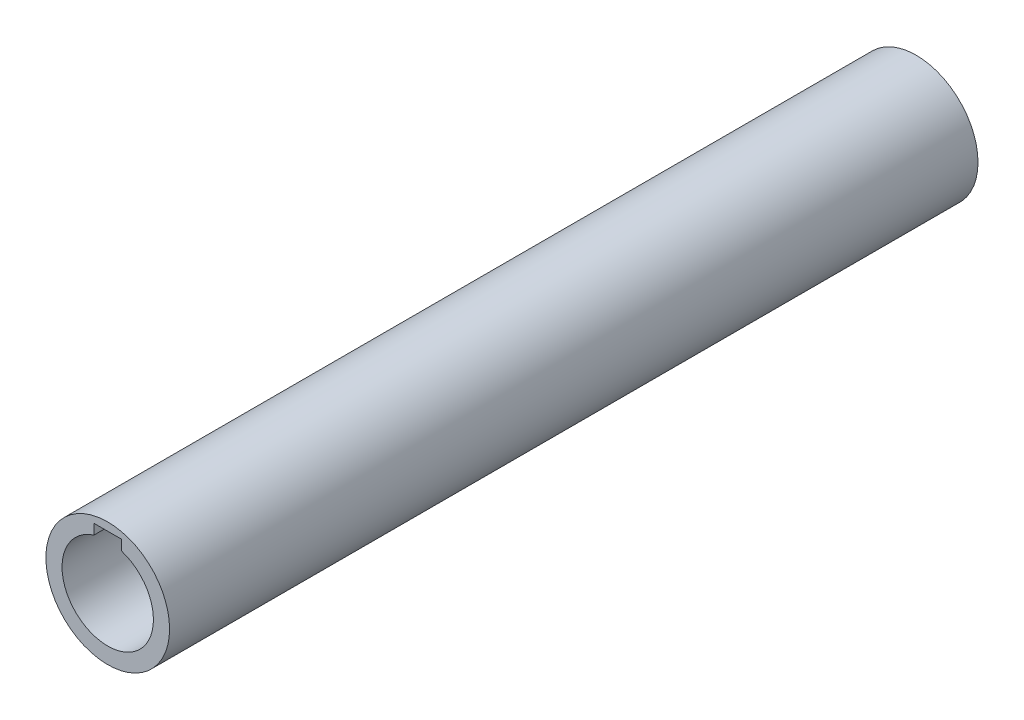
ISO-10303-21;
HEADER;
FILE_DESCRIPTION(('STEP AP214'),'2;1');
FILE_NAME('part.step','',(''),(''),'','','');
FILE_SCHEMA(('AUTOMOTIVE_DESIGN { 1 0 10303 214 1 1 1 1 }'));
ENDSEC;
DATA;
#1=APPLICATION_CONTEXT('core data for automotive mechanical design processes');
#2=APPLICATION_PROTOCOL_DEFINITION('international standard','automotive_design',2000,#1);
#3=PRODUCT_CONTEXT('',#1,'mechanical');
#4=PRODUCT('Part','Part','',(#3));
#5=PRODUCT_RELATED_PRODUCT_CATEGORY('part','',(#4));
#6=PRODUCT_DEFINITION_FORMATION('','',#4);
#7=PRODUCT_DEFINITION_CONTEXT('part definition',#1,'design');
#8=PRODUCT_DEFINITION('design','',#6,#7);
#9=PRODUCT_DEFINITION_SHAPE('','',#8);
#10=(LENGTH_UNIT() NAMED_UNIT(*) SI_UNIT(.MILLI.,.METRE.));
#11=(NAMED_UNIT(*) PLANE_ANGLE_UNIT() SI_UNIT($,.RADIAN.));
#12=(NAMED_UNIT(*) SI_UNIT($,.STERADIAN.) SOLID_ANGLE_UNIT());
#13=UNCERTAINTY_MEASURE_WITH_UNIT(LENGTH_MEASURE(1.E-05),#10,'distance_accuracy_value','');
#14=(GEOMETRIC_REPRESENTATION_CONTEXT(3) GLOBAL_UNCERTAINTY_ASSIGNED_CONTEXT((#13)) GLOBAL_UNIT_ASSIGNED_CONTEXT((#10,
#11,#12)) REPRESENTATION_CONTEXT('',''));
#15=CARTESIAN_POINT('',(0.,0.,0.));
#16=DIRECTION('',(0.,0.,1.));
#17=DIRECTION('',(1.,0.,0.));
#18=AXIS2_PLACEMENT_3D('',#15,#16,#17);
#19=CARTESIAN_POINT('',(0.,0.,-250.));
#20=DIRECTION('',(0.,0.,-1.));
#21=DIRECTION('',(1.,0.,0.));
#22=AXIS2_PLACEMENT_3D('',#19,#20,#21);
#23=PLANE('',#22);
#24=CARTESIAN_POINT('',(0.,0.,-250.));
#25=DIRECTION('',(0.,0.,1.));
#26=DIRECTION('',(1.,0.,0.));
#27=AXIS2_PLACEMENT_3D('',#24,#25,#26);
#28=CIRCLE('',#27,38.25);
#29=CARTESIAN_POINT('',(38.25,0.,-250.));
#30=VERTEX_POINT('',#29);
#31=EDGE_CURVE('E134',#30,#30,#28,.T.);
#32=ORIENTED_EDGE('',*,*,#31,.F.);
#33=EDGE_LOOP('',(#32));
#34=FACE_BOUND('',#33,.T.);
#35=DIRECTION('',(0.,-1.,0.));
#36=VECTOR('',#35,1.);
#37=CARTESIAN_POINT('',(-8.5,26.9409075570961,-250.));
#38=LINE('',#37,#36);
#39=CARTESIAN_POINT('',(-8.5,33.25,-250.));
#40=VERTEX_POINT('',#39);
#41=CARTESIAN_POINT('',(-8.5,26.9409075570961,-250.));
#42=VERTEX_POINT('',#41);
#43=EDGE_CURVE('E128',#40,#42,#38,.T.);
#44=ORIENTED_EDGE('',*,*,#43,.T.);
#45=CARTESIAN_POINT('',(0.,0.,-250.));
#46=DIRECTION('',(0.,0.,1.));
#47=DIRECTION('',(1.,0.,0.));
#48=AXIS2_PLACEMENT_3D('',#45,#46,#47);
#49=CIRCLE('',#48,28.25);
#50=CARTESIAN_POINT('',(8.5,26.9409075570961,-250.));
#51=VERTEX_POINT('',#50);
#52=EDGE_CURVE('E49',#42,#51,#49,.T.);
#53=ORIENTED_EDGE('',*,*,#52,.T.);
#54=DIRECTION('',(0.,1.,0.));
#55=VECTOR('',#54,1.);
#56=CARTESIAN_POINT('',(8.5,26.9409075570961,-250.));
#57=LINE('',#56,#55);
#58=CARTESIAN_POINT('',(8.5,33.25,-250.));
#59=VERTEX_POINT('',#58);
#60=EDGE_CURVE('E119',#51,#59,#57,.T.);
#61=ORIENTED_EDGE('',*,*,#60,.T.);
#62=DIRECTION('',(-1.,0.,0.));
#63=VECTOR('',#62,1.);
#64=CARTESIAN_POINT('',(8.5,33.25,-250.));
#65=LINE('',#64,#63);
#66=EDGE_CURVE('E122',#59,#40,#65,.T.);
#67=ORIENTED_EDGE('',*,*,#66,.T.);
#68=EDGE_LOOP('',(#44,#53,#61,#67));
#69=FACE_BOUND('',#68,.T.);
#70=ADVANCED_FACE('F34',(#34,#69),#23,.T.);
#71=CARTESIAN_POINT('',(0.,0.,250.));
#72=DIRECTION('',(0.,0.,-1.));
#73=DIRECTION('',(-1.,0.,0.));
#74=AXIS2_PLACEMENT_3D('',#71,#72,#73);
#75=CYLINDRICAL_SURFACE('',#74,38.25);
#76=CARTESIAN_POINT('',(0.,0.,250.));
#77=DIRECTION('',(0.,0.,1.));
#78=DIRECTION('',(1.,0.,0.));
#79=AXIS2_PLACEMENT_3D('',#76,#77,#78);
#80=CIRCLE('',#79,38.25);
#81=CARTESIAN_POINT('',(38.25,0.,250.));
#82=VERTEX_POINT('',#81);
#83=EDGE_CURVE('E11',#82,#82,#80,.T.);
#84=ORIENTED_EDGE('',*,*,#83,.F.);
#85=EDGE_LOOP('',(#84));
#86=FACE_BOUND('',#85,.T.);
#87=ORIENTED_EDGE('',*,*,#31,.T.);
#88=EDGE_LOOP('',(#87));
#89=FACE_BOUND('',#88,.T.);
#90=ADVANCED_FACE('F36',(#86,#89),#75,.T.);
#91=CARTESIAN_POINT('',(0.,0.,250.));
#92=DIRECTION('',(0.,0.,1.));
#93=DIRECTION('',(1.,0.,0.));
#94=AXIS2_PLACEMENT_3D('',#91,#92,#93);
#95=PLANE('',#94);
#96=CARTESIAN_POINT('',(0.,0.,250.));
#97=DIRECTION('',(0.,0.,1.));
#98=DIRECTION('',(1.,0.,0.));
#99=AXIS2_PLACEMENT_3D('',#96,#97,#98);
#100=CIRCLE('',#99,28.25);
#101=CARTESIAN_POINT('',(-8.5,26.9409075570961,250.));
#102=VERTEX_POINT('',#101);
#103=CARTESIAN_POINT('',(8.5,26.9409075570961,250.));
#104=VERTEX_POINT('',#103);
#105=EDGE_CURVE('E57',#102,#104,#100,.T.);
#106=ORIENTED_EDGE('',*,*,#105,.F.);
#107=DIRECTION('',(0.,-1.,0.));
#108=VECTOR('',#107,1.);
#109=CARTESIAN_POINT('',(-8.5,26.9409075570961,250.));
#110=LINE('',#109,#108);
#111=CARTESIAN_POINT('',(-8.5,33.25,250.));
#112=VERTEX_POINT('',#111);
#113=EDGE_CURVE('E144',#112,#102,#110,.T.);
#114=ORIENTED_EDGE('',*,*,#113,.F.);
#115=DIRECTION('',(-1.,0.,0.));
#116=VECTOR('',#115,1.);
#117=CARTESIAN_POINT('',(8.5,33.25,250.));
#118=LINE('',#117,#116);
#119=CARTESIAN_POINT('',(8.5,33.25,250.));
#120=VERTEX_POINT('',#119);
#121=EDGE_CURVE('E158',#120,#112,#118,.T.);
#122=ORIENTED_EDGE('',*,*,#121,.F.);
#123=DIRECTION('',(0.,1.,0.));
#124=VECTOR('',#123,1.);
#125=CARTESIAN_POINT('',(8.5,26.9409075570961,250.));
#126=LINE('',#125,#124);
#127=EDGE_CURVE('E155',#104,#120,#126,.T.);
#128=ORIENTED_EDGE('',*,*,#127,.F.);
#129=EDGE_LOOP('',(#106,#114,#122,#128));
#130=FACE_BOUND('',#129,.T.);
#131=ORIENTED_EDGE('',*,*,#83,.T.);
#132=EDGE_LOOP('',(#131));
#133=FACE_BOUND('',#132,.T.);
#134=ADVANCED_FACE('F174',(#130,#133),#95,.T.);
#135=CARTESIAN_POINT('',(0.,0.,200.));
#136=DIRECTION('',(0.,0.,1.));
#137=DIRECTION('',(1.,0.,0.));
#138=AXIS2_PLACEMENT_3D('',#135,#136,#137);
#139=CYLINDRICAL_SURFACE('',#138,28.25);
#140=ORIENTED_EDGE('',*,*,#105,.T.);
#141=DIRECTION('',(0.,0.,1.));
#142=VECTOR('',#141,1.);
#143=CARTESIAN_POINT('',(8.5,26.9409075570961,200.));
#144=LINE('',#143,#142);
#145=CARTESIAN_POINT('',(8.5,26.9409075570961,200.));
#146=VERTEX_POINT('',#145);
#147=EDGE_CURVE('E153',#146,#104,#144,.T.);
#148=ORIENTED_EDGE('',*,*,#147,.F.);
#149=CARTESIAN_POINT('',(0.,0.,200.));
#150=DIRECTION('',(0.,0.,1.));
#151=DIRECTION('',(1.,0.,0.));
#152=AXIS2_PLACEMENT_3D('',#149,#150,#151);
#153=CIRCLE('',#152,28.25);
#154=CARTESIAN_POINT('',(-8.5,26.9409075570961,200.));
#155=VERTEX_POINT('',#154);
#156=EDGE_CURVE('E140',#155,#146,#153,.T.);
#157=ORIENTED_EDGE('',*,*,#156,.F.);
#158=DIRECTION('',(0.,0.,1.));
#159=VECTOR('',#158,1.);
#160=CARTESIAN_POINT('',(-8.5,26.9409075570961,200.));
#161=LINE('',#160,#159);
#162=EDGE_CURVE('E42',#155,#102,#161,.T.);
#163=ORIENTED_EDGE('',*,*,#162,.T.);
#164=EDGE_LOOP('',(#140,#148,#157,#163));
#165=FACE_BOUND('',#164,.T.);
#166=ADVANCED_FACE('F183',(#165),#139,.F.);
#167=CARTESIAN_POINT('',(-8.5,26.9409075570961,200.));
#168=DIRECTION('',(-1.,0.,0.));
#169=DIRECTION('',(0.,-1.,0.));
#170=AXIS2_PLACEMENT_3D('',#167,#168,#169);
#171=PLANE('',#170);
#172=ORIENTED_EDGE('',*,*,#113,.T.);
#173=ORIENTED_EDGE('',*,*,#162,.F.);
#174=DIRECTION('',(0.,-1.,0.));
#175=VECTOR('',#174,1.);
#176=CARTESIAN_POINT('',(-8.5,26.9409075570961,200.));
#177=LINE('',#176,#175);
#178=CARTESIAN_POINT('',(-8.5,33.25,200.));
#179=VERTEX_POINT('',#178);
#180=EDGE_CURVE('E150',#179,#155,#177,.T.);
#181=ORIENTED_EDGE('',*,*,#180,.F.);
#182=DIRECTION('',(0.,0.,1.));
#183=VECTOR('',#182,1.);
#184=CARTESIAN_POINT('',(-8.5,33.25,200.));
#185=LINE('',#184,#183);
#186=EDGE_CURVE('E164',#179,#112,#185,.T.);
#187=ORIENTED_EDGE('',*,*,#186,.T.);
#188=EDGE_LOOP('',(#172,#173,#181,#187));
#189=FACE_BOUND('',#188,.T.);
#190=ADVANCED_FACE('F185',(#189),#171,.F.);
#191=CARTESIAN_POINT('',(8.5,33.25,200.));
#192=DIRECTION('',(0.,1.,0.));
#193=DIRECTION('',(0.,0.,1.));
#194=AXIS2_PLACEMENT_3D('',#191,#192,#193);
#195=PLANE('',#194);
#196=ORIENTED_EDGE('',*,*,#121,.T.);
#197=ORIENTED_EDGE('',*,*,#186,.F.);
#198=DIRECTION('',(-1.,0.,0.));
#199=VECTOR('',#198,1.);
#200=CARTESIAN_POINT('',(8.5,33.25,200.));
#201=LINE('',#200,#199);
#202=CARTESIAN_POINT('',(8.5,33.25,200.));
#203=VERTEX_POINT('',#202);
#204=EDGE_CURVE('E147',#203,#179,#201,.T.);
#205=ORIENTED_EDGE('',*,*,#204,.F.);
#206=DIRECTION('',(0.,0.,1.));
#207=VECTOR('',#206,1.);
#208=CARTESIAN_POINT('',(8.5,33.25,200.));
#209=LINE('',#208,#207);
#210=EDGE_CURVE('E166',#203,#120,#209,.T.);
#211=ORIENTED_EDGE('',*,*,#210,.T.);
#212=EDGE_LOOP('',(#196,#197,#205,#211));
#213=FACE_BOUND('',#212,.T.);
#214=ADVANCED_FACE('F178',(#213),#195,.F.);
#215=CARTESIAN_POINT('',(8.5,26.9409075570961,200.));
#216=DIRECTION('',(1.,0.,0.));
#217=DIRECTION('',(0.,1.,0.));
#218=AXIS2_PLACEMENT_3D('',#215,#216,#217);
#219=PLANE('',#218);
#220=ORIENTED_EDGE('',*,*,#127,.T.);
#221=ORIENTED_EDGE('',*,*,#210,.F.);
#222=DIRECTION('',(0.,1.,0.));
#223=VECTOR('',#222,1.);
#224=CARTESIAN_POINT('',(8.5,26.9409075570961,200.));
#225=LINE('',#224,#223);
#226=EDGE_CURVE('E143',#146,#203,#225,.T.);
#227=ORIENTED_EDGE('',*,*,#226,.F.);
#228=ORIENTED_EDGE('',*,*,#147,.T.);
#229=EDGE_LOOP('',(#220,#221,#227,#228));
#230=FACE_BOUND('',#229,.T.);
#231=ADVANCED_FACE('F170',(#230),#219,.F.);
#232=CARTESIAN_POINT('',(0.,0.,200.));
#233=DIRECTION('',(0.,0.,1.));
#234=DIRECTION('',(1.,0.,0.));
#235=AXIS2_PLACEMENT_3D('',#232,#233,#234);
#236=PLANE('',#235);
#237=ORIENTED_EDGE('',*,*,#156,.T.);
#238=ORIENTED_EDGE('',*,*,#226,.T.);
#239=ORIENTED_EDGE('',*,*,#204,.T.);
#240=ORIENTED_EDGE('',*,*,#180,.T.);
#241=EDGE_LOOP('',(#237,#238,#239,#240));
#242=FACE_BOUND('',#241,.T.);
#243=ADVANCED_FACE('F182',(#242),#236,.T.);
#244=CARTESIAN_POINT('',(0.,0.,-200.));
#245=DIRECTION('',(0.,0.,-1.));
#246=DIRECTION('',(-1.,0.,0.));
#247=AXIS2_PLACEMENT_3D('',#244,#245,#246);
#248=CYLINDRICAL_SURFACE('',#247,28.25);
#249=ORIENTED_EDGE('',*,*,#52,.F.);
#250=DIRECTION('',(0.,0.,-1.));
#251=VECTOR('',#250,1.);
#252=CARTESIAN_POINT('',(-8.5,26.9409075570961,-200.));
#253=LINE('',#252,#251);
#254=CARTESIAN_POINT('',(-8.5,26.9409075570961,-200.));
#255=VERTEX_POINT('',#254);
#256=EDGE_CURVE('E104',#255,#42,#253,.T.);
#257=ORIENTED_EDGE('',*,*,#256,.F.);
#258=CARTESIAN_POINT('',(0.,0.,-200.));
#259=DIRECTION('',(0.,0.,1.));
#260=DIRECTION('',(1.,0.,0.));
#261=AXIS2_PLACEMENT_3D('',#258,#259,#260);
#262=CIRCLE('',#261,28.25);
#263=CARTESIAN_POINT('',(8.5,26.9409075570961,-200.));
#264=VERTEX_POINT('',#263);
#265=EDGE_CURVE('E111',#255,#264,#262,.T.);
#266=ORIENTED_EDGE('',*,*,#265,.T.);
#267=DIRECTION('',(0.,0.,-1.));
#268=VECTOR('',#267,1.);
#269=CARTESIAN_POINT('',(8.5,26.9409075570961,-200.));
#270=LINE('',#269,#268);
#271=EDGE_CURVE('E132',#264,#51,#270,.T.);
#272=ORIENTED_EDGE('',*,*,#271,.T.);
#273=EDGE_LOOP('',(#249,#257,#266,#272));
#274=FACE_BOUND('',#273,.T.);
#275=ADVANCED_FACE('F114',(#274),#248,.F.);
#276=CARTESIAN_POINT('',(8.5,26.9409075570961,-200.));
#277=DIRECTION('',(-1.,0.,0.));
#278=DIRECTION('',(0.,-1.,0.));
#279=AXIS2_PLACEMENT_3D('',#276,#277,#278);
#280=PLANE('',#279);
#281=ORIENTED_EDGE('',*,*,#60,.F.);
#282=ORIENTED_EDGE('',*,*,#271,.F.);
#283=DIRECTION('',(0.,1.,0.));
#284=VECTOR('',#283,1.);
#285=CARTESIAN_POINT('',(8.5,26.9409075570961,-200.));
#286=LINE('',#285,#284);
#287=CARTESIAN_POINT('',(8.5,33.25,-200.));
#288=VERTEX_POINT('',#287);
#289=EDGE_CURVE('E116',#264,#288,#286,.T.);
#290=ORIENTED_EDGE('',*,*,#289,.T.);
#291=DIRECTION('',(0.,0.,-1.));
#292=VECTOR('',#291,1.);
#293=CARTESIAN_POINT('',(8.5,33.25,-200.));
#294=LINE('',#293,#292);
#295=EDGE_CURVE('E135',#288,#59,#294,.T.);
#296=ORIENTED_EDGE('',*,*,#295,.T.);
#297=EDGE_LOOP('',(#281,#282,#290,#296));
#298=FACE_BOUND('',#297,.T.);
#299=ADVANCED_FACE('F211',(#298),#280,.T.);
#300=CARTESIAN_POINT('',(8.5,33.25,-200.));
#301=DIRECTION('',(0.,-1.,0.));
#302=DIRECTION('',(0.,0.,-1.));
#303=AXIS2_PLACEMENT_3D('',#300,#301,#302);
#304=PLANE('',#303);
#305=ORIENTED_EDGE('',*,*,#66,.F.);
#306=ORIENTED_EDGE('',*,*,#295,.F.);
#307=DIRECTION('',(-1.,0.,0.));
#308=VECTOR('',#307,1.);
#309=CARTESIAN_POINT('',(8.5,33.25,-200.));
#310=LINE('',#309,#308);
#311=CARTESIAN_POINT('',(-8.5,33.25,-200.));
#312=VERTEX_POINT('',#311);
#313=EDGE_CURVE('E110',#288,#312,#310,.T.);
#314=ORIENTED_EDGE('',*,*,#313,.T.);
#315=DIRECTION('',(0.,0.,-1.));
#316=VECTOR('',#315,1.);
#317=CARTESIAN_POINT('',(-8.5,33.25,-200.));
#318=LINE('',#317,#316);
#319=EDGE_CURVE('E106',#312,#40,#318,.T.);
#320=ORIENTED_EDGE('',*,*,#319,.T.);
#321=EDGE_LOOP('',(#305,#306,#314,#320));
#322=FACE_BOUND('',#321,.T.);
#323=ADVANCED_FACE('F266',(#322),#304,.T.);
#324=CARTESIAN_POINT('',(-8.5,26.9409075570961,-200.));
#325=DIRECTION('',(1.,0.,0.));
#326=DIRECTION('',(0.,1.,0.));
#327=AXIS2_PLACEMENT_3D('',#324,#325,#326);
#328=PLANE('',#327);
#329=ORIENTED_EDGE('',*,*,#43,.F.);
#330=ORIENTED_EDGE('',*,*,#319,.F.);
#331=DIRECTION('',(0.,-1.,0.));
#332=VECTOR('',#331,1.);
#333=CARTESIAN_POINT('',(-8.5,26.9409075570961,-200.));
#334=LINE('',#333,#332);
#335=EDGE_CURVE('E101',#312,#255,#334,.T.);
#336=ORIENTED_EDGE('',*,*,#335,.T.);
#337=ORIENTED_EDGE('',*,*,#256,.T.);
#338=EDGE_LOOP('',(#329,#330,#336,#337));
#339=FACE_BOUND('',#338,.T.);
#340=ADVANCED_FACE('F103',(#339),#328,.T.);
#341=CARTESIAN_POINT('',(0.,0.,-200.));
#342=DIRECTION('',(0.,0.,-1.));
#343=DIRECTION('',(1.,0.,0.));
#344=AXIS2_PLACEMENT_3D('',#341,#342,#343);
#345=PLANE('',#344);
#346=ORIENTED_EDGE('',*,*,#265,.F.);
#347=ORIENTED_EDGE('',*,*,#335,.F.);
#348=ORIENTED_EDGE('',*,*,#313,.F.);
#349=ORIENTED_EDGE('',*,*,#289,.F.);
#350=EDGE_LOOP('',(#346,#347,#348,#349));
#351=FACE_BOUND('',#350,.T.);
#352=ADVANCED_FACE('F118',(#351),#345,.T.);
#353=CLOSED_SHELL('',(#70,#90,#134,#166,#190,#214,#231,#243,#275,#299,#323,#340,#352));
#354=MANIFOLD_SOLID_BREP('B2',#353);
#355=ADVANCED_BREP_SHAPE_REPRESENTATION('',(#18,#354),#14);
#356=SHAPE_DEFINITION_REPRESENTATION(#9,#355);
ENDSEC;
END-ISO-10303-21;
